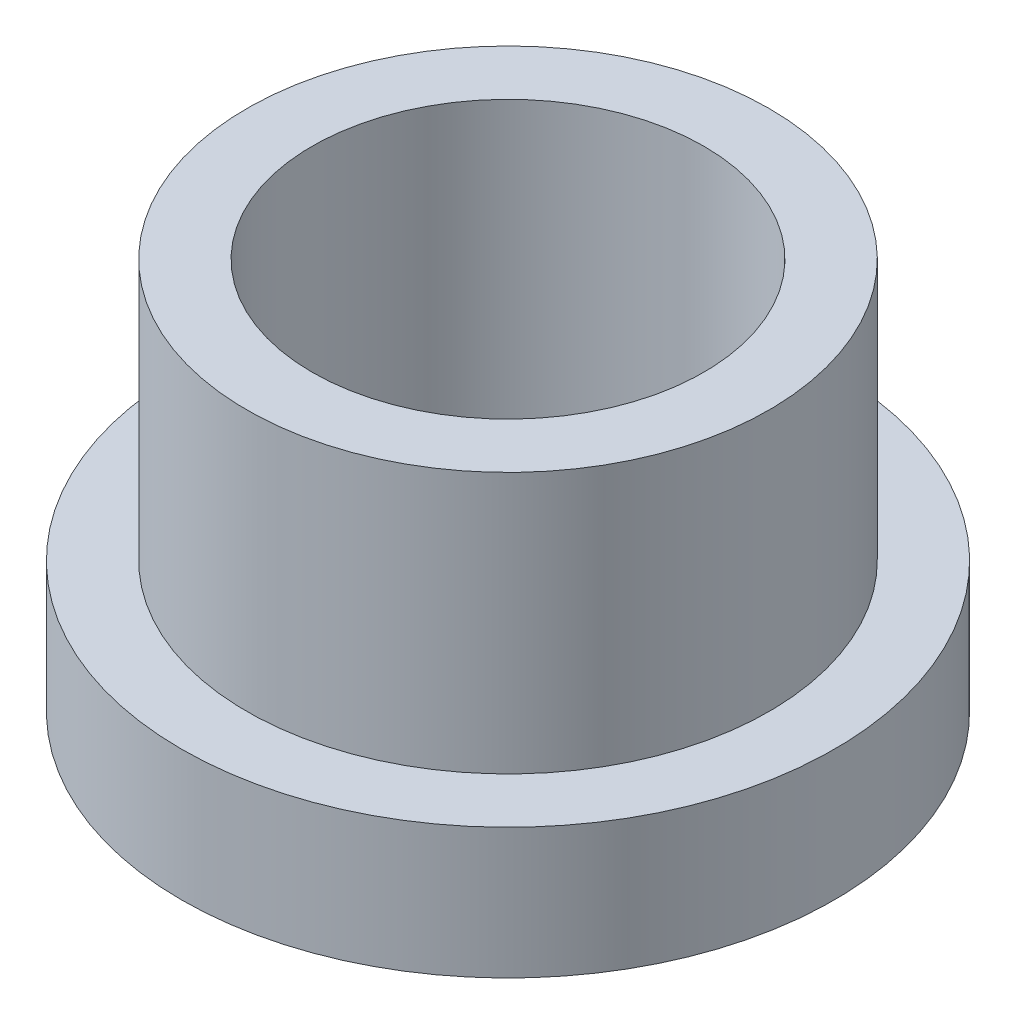
ISO-10303-21;
HEADER;
FILE_DESCRIPTION(('STEP AP214'),'2;1');
FILE_NAME('part.step','',(''),(''),'','','');
FILE_SCHEMA(('AUTOMOTIVE_DESIGN { 1 0 10303 214 1 1 1 1 }'));
ENDSEC;
DATA;
#1=APPLICATION_CONTEXT('core data for automotive mechanical design processes');
#2=APPLICATION_PROTOCOL_DEFINITION('international standard','automotive_design',2000,#1);
#3=PRODUCT_CONTEXT('',#1,'mechanical');
#4=PRODUCT('Part','Part','',(#3));
#5=PRODUCT_RELATED_PRODUCT_CATEGORY('part','',(#4));
#6=PRODUCT_DEFINITION_FORMATION('','',#4);
#7=PRODUCT_DEFINITION_CONTEXT('part definition',#1,'design');
#8=PRODUCT_DEFINITION('design','',#6,#7);
#9=PRODUCT_DEFINITION_SHAPE('','',#8);
#10=(LENGTH_UNIT() NAMED_UNIT(*) SI_UNIT(.MILLI.,.METRE.));
#11=(NAMED_UNIT(*) PLANE_ANGLE_UNIT() SI_UNIT($,.RADIAN.));
#12=(NAMED_UNIT(*) SI_UNIT($,.STERADIAN.) SOLID_ANGLE_UNIT());
#13=UNCERTAINTY_MEASURE_WITH_UNIT(LENGTH_MEASURE(1.E-05),#10,'distance_accuracy_value','');
#14=(GEOMETRIC_REPRESENTATION_CONTEXT(3) GLOBAL_UNCERTAINTY_ASSIGNED_CONTEXT((#13)) GLOBAL_UNIT_ASSIGNED_CONTEXT((#10,
#11,#12)) REPRESENTATION_CONTEXT('',''));
#15=CARTESIAN_POINT('',(0.,0.,0.));
#16=DIRECTION('',(0.,0.,1.));
#17=DIRECTION('',(1.,0.,0.));
#18=AXIS2_PLACEMENT_3D('',#15,#16,#17);
#19=CARTESIAN_POINT('',(0.,9.525,0.));
#20=DIRECTION('',(0.,1.,0.));
#21=DIRECTION('',(0.,0.,1.));
#22=AXIS2_PLACEMENT_3D('',#19,#20,#21);
#23=PLANE('',#22);
#24=CARTESIAN_POINT('',(0.,9.525,0.));
#25=DIRECTION('',(0.,1.,0.));
#26=DIRECTION('',(0.,0.,1.));
#27=AXIS2_PLACEMENT_3D('',#24,#25,#26);
#28=CIRCLE('',#27,6.35);
#29=CARTESIAN_POINT('',(0.,9.525,-6.35));
#30=VERTEX_POINT('',#29);
#31=EDGE_CURVE('E10',#30,#30,#28,.T.);
#32=ORIENTED_EDGE('',*,*,#31,.T.);
#33=EDGE_LOOP('',(#32));
#34=FACE_BOUND('',#33,.T.);
#35=CARTESIAN_POINT('',(0.,9.525,0.));
#36=DIRECTION('',(0.,1.,0.));
#37=DIRECTION('',(0.,0.,1.));
#38=AXIS2_PLACEMENT_3D('',#35,#36,#37);
#39=CIRCLE('',#38,4.7625);
#40=CARTESIAN_POINT('',(0.,9.525,-4.7625));
#41=VERTEX_POINT('',#40);
#42=EDGE_CURVE('E39',#41,#41,#39,.T.);
#43=ORIENTED_EDGE('',*,*,#42,.F.);
#44=EDGE_LOOP('',(#43));
#45=FACE_BOUND('',#44,.T.);
#46=ADVANCED_FACE('F32',(#34,#45),#23,.T.);
#47=CARTESIAN_POINT('',(0.,0.,0.));
#48=DIRECTION('',(0.,1.,0.));
#49=DIRECTION('',(0.,0.,1.));
#50=AXIS2_PLACEMENT_3D('',#47,#48,#49);
#51=PLANE('',#50);
#52=CARTESIAN_POINT('',(0.,0.,0.));
#53=DIRECTION('',(0.,1.,0.));
#54=DIRECTION('',(0.,0.,1.));
#55=AXIS2_PLACEMENT_3D('',#52,#53,#54);
#56=CIRCLE('',#55,4.7625);
#57=CARTESIAN_POINT('',(0.,0.,-4.7625));
#58=VERTEX_POINT('',#57);
#59=EDGE_CURVE('E43',#58,#58,#56,.T.);
#60=ORIENTED_EDGE('',*,*,#59,.T.);
#61=EDGE_LOOP('',(#60));
#62=FACE_BOUND('',#61,.T.);
#63=CARTESIAN_POINT('',(0.,0.,0.));
#64=DIRECTION('',(0.,1.,0.));
#65=DIRECTION('',(0.,0.,1.));
#66=AXIS2_PLACEMENT_3D('',#63,#64,#65);
#67=CIRCLE('',#66,7.9375);
#68=CARTESIAN_POINT('',(0.,0.,7.9375));
#69=VERTEX_POINT('',#68);
#70=EDGE_CURVE('E50',#69,#69,#67,.T.);
#71=ORIENTED_EDGE('',*,*,#70,.F.);
#72=EDGE_LOOP('',(#71));
#73=FACE_BOUND('',#72,.T.);
#74=ADVANCED_FACE('F75',(#62,#73),#51,.F.);
#75=CARTESIAN_POINT('',(0.,9.525,0.));
#76=DIRECTION('',(0.,-1.,0.));
#77=DIRECTION('',(0.,0.,-1.));
#78=AXIS2_PLACEMENT_3D('',#75,#76,#77);
#79=CYLINDRICAL_SURFACE('',#78,6.35);
#80=CARTESIAN_POINT('',(0.,3.175,0.));
#81=DIRECTION('',(0.,1.,0.));
#82=DIRECTION('',(0.,0.,1.));
#83=AXIS2_PLACEMENT_3D('',#80,#81,#82);
#84=CIRCLE('',#83,6.35);
#85=CARTESIAN_POINT('',(0.,3.175,-6.35));
#86=VERTEX_POINT('',#85);
#87=EDGE_CURVE('E53',#86,#86,#84,.T.);
#88=CARTESIAN_POINT('',(0.,3.175,-6.35));
#89=CARTESIAN_POINT('',(0.,3.24114583333333,-6.35));
#90=CARTESIAN_POINT('',(0.,3.30729166666667,-6.35));
#91=CARTESIAN_POINT('',(0.,3.43958333333333,-6.35));
#92=CARTESIAN_POINT('',(0.,3.50572916666667,-6.35));
#93=CARTESIAN_POINT('',(0.,3.63802083333333,-6.35));
#94=CARTESIAN_POINT('',(0.,3.70416666666667,-6.35));
#95=CARTESIAN_POINT('',(0.,3.83645833333333,-6.35));
#96=CARTESIAN_POINT('',(0.,3.90260416666667,-6.35));
#97=CARTESIAN_POINT('',(0.,4.03489583333333,-6.35));
#98=CARTESIAN_POINT('',(0.,4.10104166666667,-6.35));
#99=CARTESIAN_POINT('',(0.,4.23333333333333,-6.35));
#100=CARTESIAN_POINT('',(0.,4.29947916666667,-6.35));
#101=CARTESIAN_POINT('',(0.,4.43177083333333,-6.35));
#102=CARTESIAN_POINT('',(0.,4.49791666666667,-6.35));
#103=CARTESIAN_POINT('',(0.,4.63020833333333,-6.35));
#104=CARTESIAN_POINT('',(0.,4.69635416666667,-6.35));
#105=CARTESIAN_POINT('',(0.,4.82864583333333,-6.35));
#106=CARTESIAN_POINT('',(0.,4.89479166666667,-6.35));
#107=CARTESIAN_POINT('',(0.,5.02708333333333,-6.35));
#108=CARTESIAN_POINT('',(0.,5.09322916666667,-6.35));
#109=CARTESIAN_POINT('',(0.,5.22552083333333,-6.35));
#110=CARTESIAN_POINT('',(0.,5.29166666666667,-6.35));
#111=CARTESIAN_POINT('',(0.,5.42395833333333,-6.35));
#112=CARTESIAN_POINT('',(0.,5.49010416666667,-6.35));
#113=CARTESIAN_POINT('',(0.,5.62239583333333,-6.35));
#114=CARTESIAN_POINT('',(0.,5.68854166666667,-6.35));
#115=CARTESIAN_POINT('',(0.,5.82083333333333,-6.35));
#116=CARTESIAN_POINT('',(0.,5.88697916666667,-6.35));
#117=CARTESIAN_POINT('',(0.,6.01927083333333,-6.35));
#118=CARTESIAN_POINT('',(0.,6.08541666666667,-6.35));
#119=CARTESIAN_POINT('',(0.,6.21770833333333,-6.35));
#120=CARTESIAN_POINT('',(0.,6.28385416666667,-6.35));
#121=CARTESIAN_POINT('',(0.,6.41614583333333,-6.35));
#122=CARTESIAN_POINT('',(0.,6.48229166666667,-6.35));
#123=CARTESIAN_POINT('',(0.,6.61458333333333,-6.35));
#124=CARTESIAN_POINT('',(0.,6.68072916666667,-6.35));
#125=CARTESIAN_POINT('',(0.,6.81302083333333,-6.35));
#126=CARTESIAN_POINT('',(0.,6.87916666666667,-6.35));
#127=CARTESIAN_POINT('',(0.,7.01145833333333,-6.35));
#128=CARTESIAN_POINT('',(0.,7.07760416666667,-6.35));
#129=CARTESIAN_POINT('',(0.,7.20989583333333,-6.35));
#130=CARTESIAN_POINT('',(0.,7.27604166666667,-6.35));
#131=CARTESIAN_POINT('',(0.,7.40833333333333,-6.35));
#132=CARTESIAN_POINT('',(0.,7.47447916666667,-6.35));
#133=CARTESIAN_POINT('',(0.,7.60677083333333,-6.35));
#134=CARTESIAN_POINT('',(0.,7.67291666666667,-6.35));
#135=CARTESIAN_POINT('',(0.,7.80520833333333,-6.35));
#136=CARTESIAN_POINT('',(0.,7.87135416666667,-6.35));
#137=CARTESIAN_POINT('',(0.,8.00364583333333,-6.35));
#138=CARTESIAN_POINT('',(0.,8.06979166666667,-6.35));
#139=CARTESIAN_POINT('',(0.,8.20208333333333,-6.35));
#140=CARTESIAN_POINT('',(0.,8.26822916666667,-6.35));
#141=CARTESIAN_POINT('',(0.,8.40052083333333,-6.35));
#142=CARTESIAN_POINT('',(0.,8.46666666666667,-6.35));
#143=CARTESIAN_POINT('',(0.,8.59895833333333,-6.35));
#144=CARTESIAN_POINT('',(0.,8.66510416666667,-6.35));
#145=CARTESIAN_POINT('',(0.,8.79739583333333,-6.35));
#146=CARTESIAN_POINT('',(0.,8.86354166666667,-6.35));
#147=CARTESIAN_POINT('',(0.,8.99583333333333,-6.35));
#148=CARTESIAN_POINT('',(0.,9.06197916666667,-6.35));
#149=CARTESIAN_POINT('',(0.,9.19427083333333,-6.35));
#150=CARTESIAN_POINT('',(0.,9.26041666666667,-6.35));
#151=CARTESIAN_POINT('',(0.,9.39270833333333,-6.35));
#152=CARTESIAN_POINT('',(0.,9.45885416666667,-6.35));
#153=CARTESIAN_POINT('',(0.,9.525,-6.35));
#154=B_SPLINE_CURVE_WITH_KNOTS('',3,(#88,#89,#90,#91,#92,#93,#94,#95,#96,#97,#98,#99,#100,#101,
#102,#103,#104,#105,#106,#107,#108,#109,#110,#111,#112,#113,#114,#115,#116,#117,#118,#119,#120,
#121,#122,#123,#124,#125,#126,#127,#128,#129,#130,#131,#132,#133,#134,#135,#136,#137,#138,#139,
#140,#141,#142,#143,#144,#145,#146,#147,#148,#149,#150,#151,#152,#153),.UNSPECIFIED.,.F.,.F.,(4,
2,2,2,2,2,2,2,2,2,2,2,2,2,2,2,2,2,2,2,2,2,2,2,2,2,2,2,2,2,2,2,4),(0.,0.1984375,0.396875,
0.5953125,0.79375,0.9921875,1.190625,1.3890625,1.5875,1.7859375,1.984375,2.1828125,2.38125,
2.5796875,2.778125,2.9765625,3.175,3.3734375,3.571875,3.7703125,3.96875,4.1671875,4.365625,
4.5640625,4.7625,4.9609375,5.159375,5.3578125,5.55625,5.7546875,5.953125,6.1515625,6.35),.UNSPECIFIED.);
#155=EDGE_CURVE('BSEAM34',#86,#30,#154,.T.);
#156=ORIENTED_EDGE('',*,*,#87,.T.);
#157=ORIENTED_EDGE('',*,*,#31,.F.);
#158=ORIENTED_EDGE('',*,*,#155,.T.);
#159=ORIENTED_EDGE('',*,*,#155,.F.);
#160=EDGE_LOOP('',(#156,#158,#157,#159));
#161=FACE_BOUND('',#160,.T.);
#162=ADVANCED_FACE('F34',(#161),#79,.T.);
#163=CARTESIAN_POINT('',(0.,9.525,0.));
#164=DIRECTION('',(0.,-1.,0.));
#165=DIRECTION('',(0.,0.,-1.));
#166=AXIS2_PLACEMENT_3D('',#163,#164,#165);
#167=CYLINDRICAL_SURFACE('',#166,4.7625);
#168=CARTESIAN_POINT('',(0.,9.525,-4.7625));
#169=CARTESIAN_POINT('',(0.,9.42578125,-4.7625));
#170=CARTESIAN_POINT('',(0.,9.3265625,-4.7625));
#171=CARTESIAN_POINT('',(0.,9.128125,-4.7625));
#172=CARTESIAN_POINT('',(0.,9.02890625,-4.7625));
#173=CARTESIAN_POINT('',(0.,8.83046875,-4.7625));
#174=CARTESIAN_POINT('',(0.,8.73125,-4.7625));
#175=CARTESIAN_POINT('',(0.,8.5328125,-4.7625));
#176=CARTESIAN_POINT('',(0.,8.43359375,-4.7625));
#177=CARTESIAN_POINT('',(0.,8.23515625,-4.7625));
#178=CARTESIAN_POINT('',(0.,8.1359375,-4.7625));
#179=CARTESIAN_POINT('',(0.,7.9375,-4.7625));
#180=CARTESIAN_POINT('',(0.,7.83828125,-4.7625));
#181=CARTESIAN_POINT('',(0.,7.63984375,-4.7625));
#182=CARTESIAN_POINT('',(0.,7.540625,-4.7625));
#183=CARTESIAN_POINT('',(0.,7.3421875,-4.7625));
#184=CARTESIAN_POINT('',(0.,7.24296875,-4.7625));
#185=CARTESIAN_POINT('',(0.,7.04453125,-4.7625));
#186=CARTESIAN_POINT('',(0.,6.9453125,-4.7625));
#187=CARTESIAN_POINT('',(0.,6.746875,-4.7625));
#188=CARTESIAN_POINT('',(0.,6.64765625,-4.7625));
#189=CARTESIAN_POINT('',(0.,6.44921875,-4.7625));
#190=CARTESIAN_POINT('',(0.,6.35,-4.7625));
#191=CARTESIAN_POINT('',(0.,6.1515625,-4.7625));
#192=CARTESIAN_POINT('',(0.,6.05234375,-4.7625));
#193=CARTESIAN_POINT('',(0.,5.85390625,-4.7625));
#194=CARTESIAN_POINT('',(0.,5.7546875,-4.7625));
#195=CARTESIAN_POINT('',(0.,5.55625,-4.7625));
#196=CARTESIAN_POINT('',(0.,5.45703125,-4.7625));
#197=CARTESIAN_POINT('',(0.,5.25859375,-4.7625));
#198=CARTESIAN_POINT('',(0.,5.159375,-4.7625));
#199=CARTESIAN_POINT('',(0.,4.9609375,-4.7625));
#200=CARTESIAN_POINT('',(0.,4.86171875,-4.7625));
#201=CARTESIAN_POINT('',(0.,4.66328125,-4.7625));
#202=CARTESIAN_POINT('',(0.,4.5640625,-4.7625));
#203=CARTESIAN_POINT('',(0.,4.365625,-4.7625));
#204=CARTESIAN_POINT('',(0.,4.26640625,-4.7625));
#205=CARTESIAN_POINT('',(0.,4.06796875,-4.7625));
#206=CARTESIAN_POINT('',(0.,3.96875,-4.7625));
#207=CARTESIAN_POINT('',(0.,3.7703125,-4.7625));
#208=CARTESIAN_POINT('',(0.,3.67109375,-4.7625));
#209=CARTESIAN_POINT('',(0.,3.47265625,-4.7625));
#210=CARTESIAN_POINT('',(0.,3.3734375,-4.7625));
#211=CARTESIAN_POINT('',(0.,3.175,-4.7625));
#212=CARTESIAN_POINT('',(0.,3.07578125,-4.7625));
#213=CARTESIAN_POINT('',(0.,2.87734375,-4.7625));
#214=CARTESIAN_POINT('',(0.,2.778125,-4.7625));
#215=CARTESIAN_POINT('',(0.,2.5796875,-4.7625));
#216=CARTESIAN_POINT('',(0.,2.48046875,-4.7625));
#217=CARTESIAN_POINT('',(0.,2.28203125,-4.7625));
#218=CARTESIAN_POINT('',(0.,2.1828125,-4.7625));
#219=CARTESIAN_POINT('',(0.,1.984375,-4.7625));
#220=CARTESIAN_POINT('',(0.,1.88515625,-4.7625));
#221=CARTESIAN_POINT('',(0.,1.68671875,-4.7625));
#222=CARTESIAN_POINT('',(0.,1.5875,-4.7625));
#223=CARTESIAN_POINT('',(0.,1.3890625,-4.7625));
#224=CARTESIAN_POINT('',(0.,1.28984375,-4.7625));
#225=CARTESIAN_POINT('',(0.,1.09140625,-4.7625));
#226=CARTESIAN_POINT('',(0.,0.992187500000001,-4.7625));
#227=CARTESIAN_POINT('',(0.,0.793750000000001,-4.7625));
#228=CARTESIAN_POINT('',(0.,0.69453125,-4.7625));
#229=CARTESIAN_POINT('',(0.,0.49609375,-4.7625));
#230=CARTESIAN_POINT('',(0.,0.396875,-4.7625));
#231=CARTESIAN_POINT('',(0.,0.1984375,-4.7625));
#232=CARTESIAN_POINT('',(0.,0.0992187500000001,-4.7625));
#233=CARTESIAN_POINT('',(0.,0.,-4.7625));
#234=B_SPLINE_CURVE_WITH_KNOTS('',3,(#168,#169,#170,#171,#172,#173,#174,#175,#176,#177,#178,
#179,#180,#181,#182,#183,#184,#185,#186,#187,#188,#189,#190,#191,#192,#193,#194,#195,#196,#197,
#198,#199,#200,#201,#202,#203,#204,#205,#206,#207,#208,#209,#210,#211,#212,#213,#214,#215,#216,
#217,#218,#219,#220,#221,#222,#223,#224,#225,#226,#227,#228,#229,#230,#231,#232,#233),
.UNSPECIFIED.,.F.,.F.,(4,2,2,2,2,2,2,2,2,2,2,2,2,2,2,2,2,2,2,2,2,2,2,2,2,2,2,2,2,2,2,2,4),(0.,
0.29765625,0.5953125,0.892968750000001,1.190625,1.48828125,1.7859375,2.08359375,2.38125,
2.67890625,2.9765625,3.27421875,3.571875,3.86953125,4.1671875,4.46484375,4.7625,5.06015625,
5.3578125,5.65546875,5.953125,6.25078125,6.5484375,6.84609375,7.14375,7.44140625,7.7390625,
8.03671875,8.334375,8.63203125,8.9296875,9.22734375,9.525),.UNSPECIFIED.);
#235=EDGE_CURVE('BSEAM64',#41,#58,#234,.T.);
#236=ORIENTED_EDGE('',*,*,#42,.T.);
#237=ORIENTED_EDGE('',*,*,#59,.F.);
#238=ORIENTED_EDGE('',*,*,#235,.T.);
#239=ORIENTED_EDGE('',*,*,#235,.F.);
#240=EDGE_LOOP('',(#236,#238,#237,#239));
#241=FACE_BOUND('',#240,.T.);
#242=ADVANCED_FACE('F64',(#241),#167,.F.);
#243=CARTESIAN_POINT('',(0.,3.175,0.));
#244=DIRECTION('',(0.,1.,0.));
#245=DIRECTION('',(0.,0.,1.));
#246=AXIS2_PLACEMENT_3D('',#243,#244,#245);
#247=PLANE('',#246);
#248=CARTESIAN_POINT('',(0.,3.175,0.));
#249=DIRECTION('',(0.,1.,0.));
#250=DIRECTION('',(0.,0.,1.));
#251=AXIS2_PLACEMENT_3D('',#248,#249,#250);
#252=CIRCLE('',#251,7.9375);
#253=CARTESIAN_POINT('',(0.,3.175,7.9375));
#254=VERTEX_POINT('',#253);
#255=EDGE_CURVE('E48',#254,#254,#252,.T.);
#256=ORIENTED_EDGE('',*,*,#255,.T.);
#257=EDGE_LOOP('',(#256));
#258=FACE_BOUND('',#257,.T.);
#259=ORIENTED_EDGE('',*,*,#87,.F.);
#260=EDGE_LOOP('',(#259));
#261=FACE_BOUND('',#260,.T.);
#262=ADVANCED_FACE('F61',(#258,#261),#247,.T.);
#263=CARTESIAN_POINT('',(0.,3.175,0.));
#264=DIRECTION('',(0.,-1.,0.));
#265=DIRECTION('',(0.,0.,-1.));
#266=AXIS2_PLACEMENT_3D('',#263,#264,#265);
#267=CYLINDRICAL_SURFACE('',#266,7.9375);
#268=ORIENTED_EDGE('',*,*,#255,.F.);
#269=EDGE_LOOP('',(#268));
#270=FACE_BOUND('',#269,.T.);
#271=ORIENTED_EDGE('',*,*,#70,.T.);
#272=EDGE_LOOP('',(#271));
#273=FACE_BOUND('',#272,.T.);
#274=ADVANCED_FACE('F63',(#270,#273),#267,.T.);
#275=CLOSED_SHELL('',(#46,#74,#162,#242,#262,#274));
#276=MANIFOLD_SOLID_BREP('B2',#275);
#277=ADVANCED_BREP_SHAPE_REPRESENTATION('',(#18,#276),#14);
#278=SHAPE_DEFINITION_REPRESENTATION(#9,#277);
ENDSEC;
END-ISO-10303-21;
